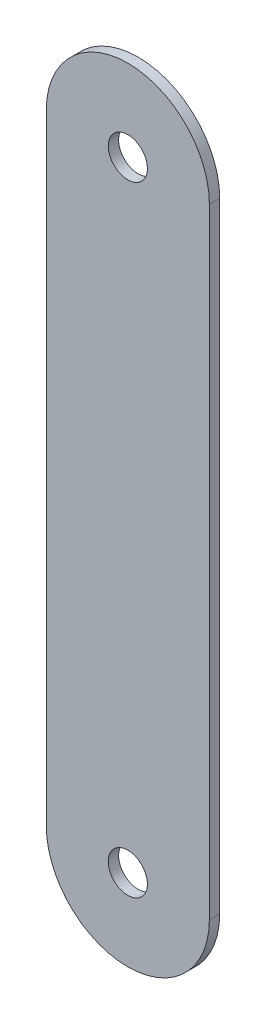
ISO-10303-21;
HEADER;
FILE_DESCRIPTION(('STEP AP214'),'2;1');
FILE_NAME('part.step','',(''),(''),'','','');
FILE_SCHEMA(('AUTOMOTIVE_DESIGN { 1 0 10303 214 1 1 1 1 }'));
ENDSEC;
DATA;
#1=APPLICATION_CONTEXT('core data for automotive mechanical design processes');
#2=APPLICATION_PROTOCOL_DEFINITION('international standard','automotive_design',2000,#1);
#3=PRODUCT_CONTEXT('',#1,'mechanical');
#4=PRODUCT('Part','Part','',(#3));
#5=PRODUCT_RELATED_PRODUCT_CATEGORY('part','',(#4));
#6=PRODUCT_DEFINITION_FORMATION('','',#4);
#7=PRODUCT_DEFINITION_CONTEXT('part definition',#1,'design');
#8=PRODUCT_DEFINITION('design','',#6,#7);
#9=PRODUCT_DEFINITION_SHAPE('','',#8);
#10=(LENGTH_UNIT() NAMED_UNIT(*) SI_UNIT(.MILLI.,.METRE.));
#11=(NAMED_UNIT(*) PLANE_ANGLE_UNIT() SI_UNIT($,.RADIAN.));
#12=(NAMED_UNIT(*) SI_UNIT($,.STERADIAN.) SOLID_ANGLE_UNIT());
#13=UNCERTAINTY_MEASURE_WITH_UNIT(LENGTH_MEASURE(1.E-05),#10,'distance_accuracy_value','');
#14=(GEOMETRIC_REPRESENTATION_CONTEXT(3) GLOBAL_UNCERTAINTY_ASSIGNED_CONTEXT((#13)) GLOBAL_UNIT_ASSIGNED_CONTEXT((#10,
#11,#12)) REPRESENTATION_CONTEXT('',''));
#15=CARTESIAN_POINT('',(0.,0.,0.));
#16=DIRECTION('',(0.,0.,1.));
#17=DIRECTION('',(1.,0.,0.));
#18=AXIS2_PLACEMENT_3D('',#15,#16,#17);
#19=CARTESIAN_POINT('',(0.,0.,-63.275));
#20=DIRECTION('',(0.,0.,1.));
#21=DIRECTION('',(1.,0.,0.));
#22=AXIS2_PLACEMENT_3D('',#19,#20,#21);
#23=PLANE('',#22);
#24=CARTESIAN_POINT('',(0.,-190.,-63.275));
#25=DIRECTION('',(0.,0.,1.));
#26=DIRECTION('',(1.,0.,0.));
#27=AXIS2_PLACEMENT_3D('',#24,#25,#26);
#28=CIRCLE('',#27,6.00000000000001);
#29=CARTESIAN_POINT('',(6.00000000000001,-190.,-63.275));
#30=VERTEX_POINT('',#29);
#31=EDGE_CURVE('E106',#30,#30,#28,.T.);
#32=ORIENTED_EDGE('',*,*,#31,.F.);
#33=EDGE_LOOP('',(#32));
#34=FACE_BOUND('',#33,.T.);
#35=CARTESIAN_POINT('',(0.,0.,-63.275));
#36=DIRECTION('',(0.,0.,1.));
#37=DIRECTION('',(1.,0.,0.));
#38=AXIS2_PLACEMENT_3D('',#35,#36,#37);
#39=CIRCLE('',#38,25.);
#40=CARTESIAN_POINT('',(25.,0.,-63.275));
#41=VERTEX_POINT('',#40);
#42=CARTESIAN_POINT('',(-25.,0.,-63.275));
#43=VERTEX_POINT('',#42);
#44=EDGE_CURVE('E91',#41,#43,#39,.T.);
#45=ORIENTED_EDGE('',*,*,#44,.T.);
#46=DIRECTION('',(0.,-1.,0.));
#47=VECTOR('',#46,1.);
#48=CARTESIAN_POINT('',(-25.,0.,-63.275));
#49=LINE('',#48,#47);
#50=CARTESIAN_POINT('',(-25.,-190.,-63.275));
#51=VERTEX_POINT('',#50);
#52=EDGE_CURVE('E86',#43,#51,#49,.T.);
#53=ORIENTED_EDGE('',*,*,#52,.T.);
#54=CARTESIAN_POINT('',(0.,-190.,-63.275));
#55=DIRECTION('',(0.,0.,1.));
#56=DIRECTION('',(1.,0.,0.));
#57=AXIS2_PLACEMENT_3D('',#54,#55,#56);
#58=CIRCLE('',#57,25.);
#59=CARTESIAN_POINT('',(25.,-190.,-63.275));
#60=VERTEX_POINT('',#59);
#61=EDGE_CURVE('E89',#51,#60,#58,.T.);
#62=ORIENTED_EDGE('',*,*,#61,.T.);
#63=DIRECTION('',(0.,1.,0.));
#64=VECTOR('',#63,1.);
#65=CARTESIAN_POINT('',(25.,0.,-63.275));
#66=LINE('',#65,#64);
#67=EDGE_CURVE('E56',#60,#41,#66,.T.);
#68=ORIENTED_EDGE('',*,*,#67,.T.);
#69=EDGE_LOOP('',(#45,#53,#62,#68));
#70=FACE_BOUND('',#69,.T.);
#71=CARTESIAN_POINT('',(0.,0.,-63.275));
#72=DIRECTION('',(0.,0.,1.));
#73=DIRECTION('',(1.,0.,0.));
#74=AXIS2_PLACEMENT_3D('',#71,#72,#73);
#75=CIRCLE('',#74,6.);
#76=CARTESIAN_POINT('',(6.,0.,-63.275));
#77=VERTEX_POINT('',#76);
#78=EDGE_CURVE('E121',#77,#77,#75,.T.);
#79=ORIENTED_EDGE('',*,*,#78,.F.);
#80=EDGE_LOOP('',(#79));
#81=FACE_BOUND('',#80,.T.);
#82=ADVANCED_FACE('F39',(#34,#70,#81),#23,.T.);
#83=CARTESIAN_POINT('',(0.,0.,-66.45));
#84=DIRECTION('',(0.,0.,1.));
#85=DIRECTION('',(1.,0.,0.));
#86=AXIS2_PLACEMENT_3D('',#83,#84,#85);
#87=PLANE('',#86);
#88=CARTESIAN_POINT('',(0.,0.,-66.45));
#89=DIRECTION('',(0.,0.,1.));
#90=DIRECTION('',(1.,0.,0.));
#91=AXIS2_PLACEMENT_3D('',#88,#89,#90);
#92=CIRCLE('',#91,25.);
#93=CARTESIAN_POINT('',(25.,0.,-66.45));
#94=VERTEX_POINT('',#93);
#95=CARTESIAN_POINT('',(-25.,0.,-66.45));
#96=VERTEX_POINT('',#95);
#97=EDGE_CURVE('E103',#94,#96,#92,.T.);
#98=ORIENTED_EDGE('',*,*,#97,.F.);
#99=DIRECTION('',(0.,1.,0.));
#100=VECTOR('',#99,1.);
#101=CARTESIAN_POINT('',(25.,0.,-66.45));
#102=LINE('',#101,#100);
#103=CARTESIAN_POINT('',(25.,-190.,-66.45));
#104=VERTEX_POINT('',#103);
#105=EDGE_CURVE('E79',#104,#94,#102,.T.);
#106=ORIENTED_EDGE('',*,*,#105,.F.);
#107=CARTESIAN_POINT('',(0.,-190.,-66.45));
#108=DIRECTION('',(0.,0.,1.));
#109=DIRECTION('',(1.,0.,0.));
#110=AXIS2_PLACEMENT_3D('',#107,#108,#109);
#111=CIRCLE('',#110,25.);
#112=CARTESIAN_POINT('',(-25.,-190.,-66.45));
#113=VERTEX_POINT('',#112);
#114=EDGE_CURVE('E73',#113,#104,#111,.T.);
#115=ORIENTED_EDGE('',*,*,#114,.F.);
#116=DIRECTION('',(0.,-1.,0.));
#117=VECTOR('',#116,1.);
#118=CARTESIAN_POINT('',(-25.,0.,-66.45));
#119=LINE('',#118,#117);
#120=EDGE_CURVE('E95',#96,#113,#119,.T.);
#121=ORIENTED_EDGE('',*,*,#120,.F.);
#122=EDGE_LOOP('',(#98,#106,#115,#121));
#123=FACE_BOUND('',#122,.T.);
#124=CARTESIAN_POINT('',(0.,-190.,-66.45));
#125=DIRECTION('',(0.,0.,1.));
#126=DIRECTION('',(1.,0.,0.));
#127=AXIS2_PLACEMENT_3D('',#124,#125,#126);
#128=CIRCLE('',#127,6.00000000000001);
#129=CARTESIAN_POINT('',(6.00000000000001,-190.,-66.45));
#130=VERTEX_POINT('',#129);
#131=EDGE_CURVE('E118',#130,#130,#128,.T.);
#132=ORIENTED_EDGE('',*,*,#131,.T.);
#133=EDGE_LOOP('',(#132));
#134=FACE_BOUND('',#133,.T.);
#135=CARTESIAN_POINT('',(0.,0.,-66.45));
#136=DIRECTION('',(0.,0.,1.));
#137=DIRECTION('',(1.,0.,0.));
#138=AXIS2_PLACEMENT_3D('',#135,#136,#137);
#139=CIRCLE('',#138,6.);
#140=CARTESIAN_POINT('',(6.,0.,-66.45));
#141=VERTEX_POINT('',#140);
#142=EDGE_CURVE('E124',#141,#141,#139,.T.);
#143=ORIENTED_EDGE('',*,*,#142,.T.);
#144=EDGE_LOOP('',(#143));
#145=FACE_BOUND('',#144,.T.);
#146=ADVANCED_FACE('F114',(#123,#134,#145),#87,.F.);
#147=CARTESIAN_POINT('',(0.,0.,-63.275));
#148=DIRECTION('',(0.,0.,-1.));
#149=DIRECTION('',(-1.,0.,0.));
#150=AXIS2_PLACEMENT_3D('',#147,#148,#149);
#151=CYLINDRICAL_SURFACE('',#150,25.);
#152=ORIENTED_EDGE('',*,*,#97,.T.);
#153=DIRECTION('',(0.,0.,-1.));
#154=VECTOR('',#153,1.);
#155=CARTESIAN_POINT('',(-25.,0.,-63.275));
#156=LINE('',#155,#154);
#157=EDGE_CURVE('E11',#43,#96,#156,.T.);
#158=ORIENTED_EDGE('',*,*,#157,.F.);
#159=ORIENTED_EDGE('',*,*,#44,.F.);
#160=DIRECTION('',(0.,0.,-1.));
#161=VECTOR('',#160,1.);
#162=CARTESIAN_POINT('',(25.,0.,-63.275));
#163=LINE('',#162,#161);
#164=EDGE_CURVE('E99',#41,#94,#163,.T.);
#165=ORIENTED_EDGE('',*,*,#164,.T.);
#166=EDGE_LOOP('',(#152,#158,#159,#165));
#167=FACE_BOUND('',#166,.T.);
#168=ADVANCED_FACE('F41',(#167),#151,.T.);
#169=CARTESIAN_POINT('',(-25.,0.,-63.275));
#170=DIRECTION('',(1.,0.,0.));
#171=DIRECTION('',(0.,1.,0.));
#172=AXIS2_PLACEMENT_3D('',#169,#170,#171);
#173=PLANE('',#172);
#174=ORIENTED_EDGE('',*,*,#120,.T.);
#175=DIRECTION('',(0.,0.,-1.));
#176=VECTOR('',#175,1.);
#177=CARTESIAN_POINT('',(-25.,-190.,-63.275));
#178=LINE('',#177,#176);
#179=EDGE_CURVE('E48',#51,#113,#178,.T.);
#180=ORIENTED_EDGE('',*,*,#179,.F.);
#181=ORIENTED_EDGE('',*,*,#52,.F.);
#182=ORIENTED_EDGE('',*,*,#157,.T.);
#183=EDGE_LOOP('',(#174,#180,#181,#182));
#184=FACE_BOUND('',#183,.T.);
#185=ADVANCED_FACE('F94',(#184),#173,.F.);
#186=CARTESIAN_POINT('',(0.,-190.,-63.275));
#187=DIRECTION('',(0.,0.,-1.));
#188=DIRECTION('',(-1.,0.,0.));
#189=AXIS2_PLACEMENT_3D('',#186,#187,#188);
#190=CYLINDRICAL_SURFACE('',#189,25.);
#191=ORIENTED_EDGE('',*,*,#114,.T.);
#192=DIRECTION('',(0.,0.,-1.));
#193=VECTOR('',#192,1.);
#194=CARTESIAN_POINT('',(25.,-190.,-63.275));
#195=LINE('',#194,#193);
#196=EDGE_CURVE('E96',#60,#104,#195,.T.);
#197=ORIENTED_EDGE('',*,*,#196,.F.);
#198=ORIENTED_EDGE('',*,*,#61,.F.);
#199=ORIENTED_EDGE('',*,*,#179,.T.);
#200=EDGE_LOOP('',(#191,#197,#198,#199));
#201=FACE_BOUND('',#200,.T.);
#202=ADVANCED_FACE('F97',(#201),#190,.T.);
#203=CARTESIAN_POINT('',(25.,0.,-63.275));
#204=DIRECTION('',(-1.,0.,0.));
#205=DIRECTION('',(0.,-1.,0.));
#206=AXIS2_PLACEMENT_3D('',#203,#204,#205);
#207=PLANE('',#206);
#208=ORIENTED_EDGE('',*,*,#105,.T.);
#209=ORIENTED_EDGE('',*,*,#164,.F.);
#210=ORIENTED_EDGE('',*,*,#67,.F.);
#211=ORIENTED_EDGE('',*,*,#196,.T.);
#212=EDGE_LOOP('',(#208,#209,#210,#211));
#213=FACE_BOUND('',#212,.T.);
#214=ADVANCED_FACE('F111',(#213),#207,.F.);
#215=CARTESIAN_POINT('',(0.,-190.,-63.275));
#216=DIRECTION('',(0.,0.,-1.));
#217=DIRECTION('',(-1.,0.,0.));
#218=AXIS2_PLACEMENT_3D('',#215,#216,#217);
#219=CYLINDRICAL_SURFACE('',#218,6.00000000000001);
#220=ORIENTED_EDGE('',*,*,#31,.T.);
#221=EDGE_LOOP('',(#220));
#222=FACE_BOUND('',#221,.T.);
#223=ORIENTED_EDGE('',*,*,#131,.F.);
#224=EDGE_LOOP('',(#223));
#225=FACE_BOUND('',#224,.T.);
#226=ADVANCED_FACE('F141',(#222,#225),#219,.F.);
#227=CARTESIAN_POINT('',(0.,0.,-63.275));
#228=DIRECTION('',(0.,0.,-1.));
#229=DIRECTION('',(-1.,0.,0.));
#230=AXIS2_PLACEMENT_3D('',#227,#228,#229);
#231=CYLINDRICAL_SURFACE('',#230,6.);
#232=ORIENTED_EDGE('',*,*,#78,.T.);
#233=EDGE_LOOP('',(#232));
#234=FACE_BOUND('',#233,.T.);
#235=ORIENTED_EDGE('',*,*,#142,.F.);
#236=EDGE_LOOP('',(#235));
#237=FACE_BOUND('',#236,.T.);
#238=ADVANCED_FACE('F130',(#234,#237),#231,.F.);
#239=CLOSED_SHELL('',(#82,#146,#168,#185,#202,#214,#226,#238));
#240=MANIFOLD_SOLID_BREP('B2',#239);
#241=ADVANCED_BREP_SHAPE_REPRESENTATION('',(#18,#240),#14);
#242=SHAPE_DEFINITION_REPRESENTATION(#9,#241);
ENDSEC;
END-ISO-10303-21;
